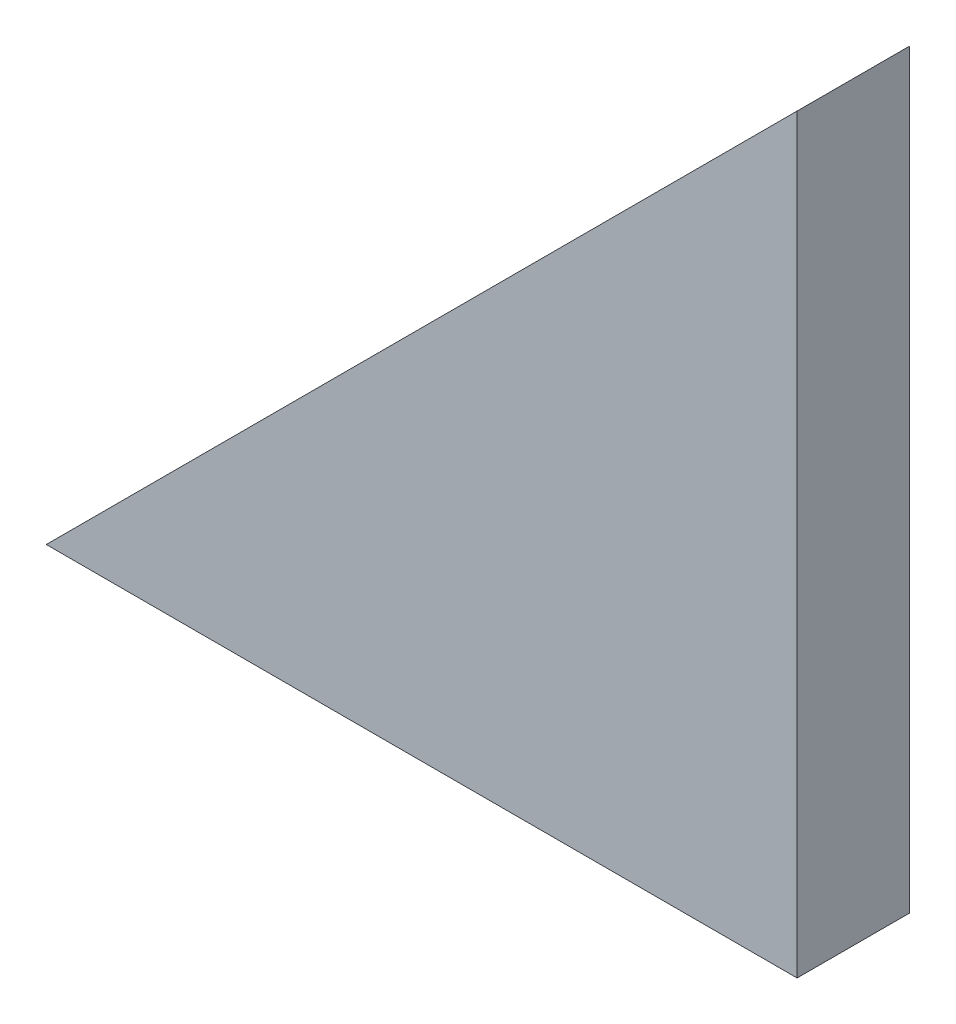
ISO-10303-21;
HEADER;
FILE_DESCRIPTION(('STEP AP214'),'2;1');
FILE_NAME('part.step','',(''),(''),'','','');
FILE_SCHEMA(('AUTOMOTIVE_DESIGN { 1 0 10303 214 1 1 1 1 }'));
ENDSEC;
DATA;
#1=APPLICATION_CONTEXT('core data for automotive mechanical design processes');
#2=APPLICATION_PROTOCOL_DEFINITION('international standard','automotive_design',2000,#1);
#3=PRODUCT_CONTEXT('',#1,'mechanical');
#4=PRODUCT('Part','Part','',(#3));
#5=PRODUCT_RELATED_PRODUCT_CATEGORY('part','',(#4));
#6=PRODUCT_DEFINITION_FORMATION('','',#4);
#7=PRODUCT_DEFINITION_CONTEXT('part definition',#1,'design');
#8=PRODUCT_DEFINITION('design','',#6,#7);
#9=PRODUCT_DEFINITION_SHAPE('','',#8);
#10=(LENGTH_UNIT() NAMED_UNIT(*) SI_UNIT(.MILLI.,.METRE.));
#11=(NAMED_UNIT(*) PLANE_ANGLE_UNIT() SI_UNIT($,.RADIAN.));
#12=(NAMED_UNIT(*) SI_UNIT($,.STERADIAN.) SOLID_ANGLE_UNIT());
#13=UNCERTAINTY_MEASURE_WITH_UNIT(LENGTH_MEASURE(1.E-05),#10,'distance_accuracy_value','');
#14=(GEOMETRIC_REPRESENTATION_CONTEXT(3) GLOBAL_UNCERTAINTY_ASSIGNED_CONTEXT((#13)) GLOBAL_UNIT_ASSIGNED_CONTEXT((#10,
#11,#12)) REPRESENTATION_CONTEXT('',''));
#15=CARTESIAN_POINT('',(0.,0.,0.));
#16=DIRECTION('',(0.,0.,1.));
#17=DIRECTION('',(1.,0.,0.));
#18=AXIS2_PLACEMENT_3D('',#15,#16,#17);
#19=CARTESIAN_POINT('',(-20.,0.,3.));
#20=DIRECTION('',(0.,1.,0.));
#21=DIRECTION('',(0.,0.,1.));
#22=AXIS2_PLACEMENT_3D('',#19,#20,#21);
#23=PLANE('',#22);
#24=DIRECTION('',(1.,0.,0.));
#25=VECTOR('',#24,1.);
#26=CARTESIAN_POINT('',(-20.,0.,0.));
#27=LINE('',#26,#25);
#28=CARTESIAN_POINT('',(-20.,0.,0.));
#29=VERTEX_POINT('',#28);
#30=CARTESIAN_POINT('',(0.,0.,0.));
#31=VERTEX_POINT('',#30);
#32=EDGE_CURVE('E86',#29,#31,#27,.T.);
#33=ORIENTED_EDGE('',*,*,#32,.T.);
#34=DIRECTION('',(0.,0.,-1.));
#35=VECTOR('',#34,1.);
#36=CARTESIAN_POINT('',(0.,0.,3.));
#37=LINE('',#36,#35);
#38=CARTESIAN_POINT('',(0.,0.,3.));
#39=VERTEX_POINT('',#38);
#40=EDGE_CURVE('E11',#39,#31,#37,.T.);
#41=ORIENTED_EDGE('',*,*,#40,.F.);
#42=DIRECTION('',(1.,0.,0.));
#43=VECTOR('',#42,1.);
#44=CARTESIAN_POINT('',(-20.,0.,3.));
#45=LINE('',#44,#43);
#46=CARTESIAN_POINT('',(-20.,0.,3.));
#47=VERTEX_POINT('',#46);
#48=EDGE_CURVE('E79',#47,#39,#45,.T.);
#49=ORIENTED_EDGE('',*,*,#48,.F.);
#50=DIRECTION('',(0.,0.,-1.));
#51=VECTOR('',#50,1.);
#52=CARTESIAN_POINT('',(-20.,0.,3.));
#53=LINE('',#52,#51);
#54=EDGE_CURVE('E87',#47,#29,#53,.T.);
#55=ORIENTED_EDGE('',*,*,#54,.T.);
#56=EDGE_LOOP('',(#33,#41,#49,#55));
#57=FACE_BOUND('',#56,.T.);
#58=ADVANCED_FACE('F39',(#57),#23,.F.);
#59=CARTESIAN_POINT('',(0.,0.,3.));
#60=DIRECTION('',(-1.,0.,0.));
#61=DIRECTION('',(0.,0.,1.));
#62=AXIS2_PLACEMENT_3D('',#59,#60,#61);
#63=PLANE('',#62);
#64=DIRECTION('',(0.,1.,0.));
#65=VECTOR('',#64,1.);
#66=CARTESIAN_POINT('',(0.,0.,0.));
#67=LINE('',#66,#65);
#68=CARTESIAN_POINT('',(0.,20.,0.));
#69=VERTEX_POINT('',#68);
#70=EDGE_CURVE('E67',#31,#69,#67,.T.);
#71=ORIENTED_EDGE('',*,*,#70,.T.);
#72=DIRECTION('',(0.,0.,-1.));
#73=VECTOR('',#72,1.);
#74=CARTESIAN_POINT('',(0.,20.,3.));
#75=LINE('',#74,#73);
#76=CARTESIAN_POINT('',(0.,20.,3.));
#77=VERTEX_POINT('',#76);
#78=EDGE_CURVE('E47',#77,#69,#75,.T.);
#79=ORIENTED_EDGE('',*,*,#78,.F.);
#80=DIRECTION('',(0.,1.,0.));
#81=VECTOR('',#80,1.);
#82=CARTESIAN_POINT('',(0.,0.,3.));
#83=LINE('',#82,#81);
#84=EDGE_CURVE('E75',#39,#77,#83,.T.);
#85=ORIENTED_EDGE('',*,*,#84,.F.);
#86=ORIENTED_EDGE('',*,*,#40,.T.);
#87=EDGE_LOOP('',(#71,#79,#85,#86));
#88=FACE_BOUND('',#87,.T.);
#89=ADVANCED_FACE('F76',(#88),#63,.F.);
#90=CARTESIAN_POINT('',(0.,20.,3.));
#91=DIRECTION('',(0.707106781186547,-0.707106781186547,0.));
#92=DIRECTION('',(0.707106781186548,0.707106781186548,0.));
#93=AXIS2_PLACEMENT_3D('',#90,#91,#92);
#94=PLANE('',#93);
#95=DIRECTION('',(-0.707106781186548,-0.707106781186548,0.));
#96=VECTOR('',#95,1.);
#97=CARTESIAN_POINT('',(0.,20.,0.));
#98=LINE('',#97,#96);
#99=EDGE_CURVE('E72',#69,#29,#98,.T.);
#100=ORIENTED_EDGE('',*,*,#99,.T.);
#101=ORIENTED_EDGE('',*,*,#54,.F.);
#102=DIRECTION('',(-0.707106781186548,-0.707106781186548,0.));
#103=VECTOR('',#102,1.);
#104=CARTESIAN_POINT('',(0.,20.,3.));
#105=LINE('',#104,#103);
#106=EDGE_CURVE('E55',#77,#47,#105,.T.);
#107=ORIENTED_EDGE('',*,*,#106,.F.);
#108=ORIENTED_EDGE('',*,*,#78,.T.);
#109=EDGE_LOOP('',(#100,#101,#107,#108));
#110=FACE_BOUND('',#109,.T.);
#111=ADVANCED_FACE('F94',(#110),#94,.F.);
#112=CARTESIAN_POINT('',(0.,0.,3.));
#113=DIRECTION('',(0.,0.,1.));
#114=DIRECTION('',(1.,0.,0.));
#115=AXIS2_PLACEMENT_3D('',#112,#113,#114);
#116=PLANE('',#115);
#117=ORIENTED_EDGE('',*,*,#48,.T.);
#118=ORIENTED_EDGE('',*,*,#84,.T.);
#119=ORIENTED_EDGE('',*,*,#106,.T.);
#120=EDGE_LOOP('',(#117,#118,#119));
#121=FACE_BOUND('',#120,.T.);
#122=ADVANCED_FACE('F82',(#121),#116,.T.);
#123=CARTESIAN_POINT('',(0.,0.,0.));
#124=DIRECTION('',(0.,0.,1.));
#125=DIRECTION('',(1.,0.,0.));
#126=AXIS2_PLACEMENT_3D('',#123,#124,#125);
#127=PLANE('',#126);
#128=ORIENTED_EDGE('',*,*,#32,.F.);
#129=ORIENTED_EDGE('',*,*,#99,.F.);
#130=ORIENTED_EDGE('',*,*,#70,.F.);
#131=EDGE_LOOP('',(#128,#129,#130));
#132=FACE_BOUND('',#131,.T.);
#133=ADVANCED_FACE('F95',(#132),#127,.F.);
#134=CLOSED_SHELL('',(#58,#89,#111,#122,#133));
#135=MANIFOLD_SOLID_BREP('B2',#134);
#136=ADVANCED_BREP_SHAPE_REPRESENTATION('',(#18,#135),#14);
#137=SHAPE_DEFINITION_REPRESENTATION(#9,#136);
ENDSEC;
END-ISO-10303-21;
